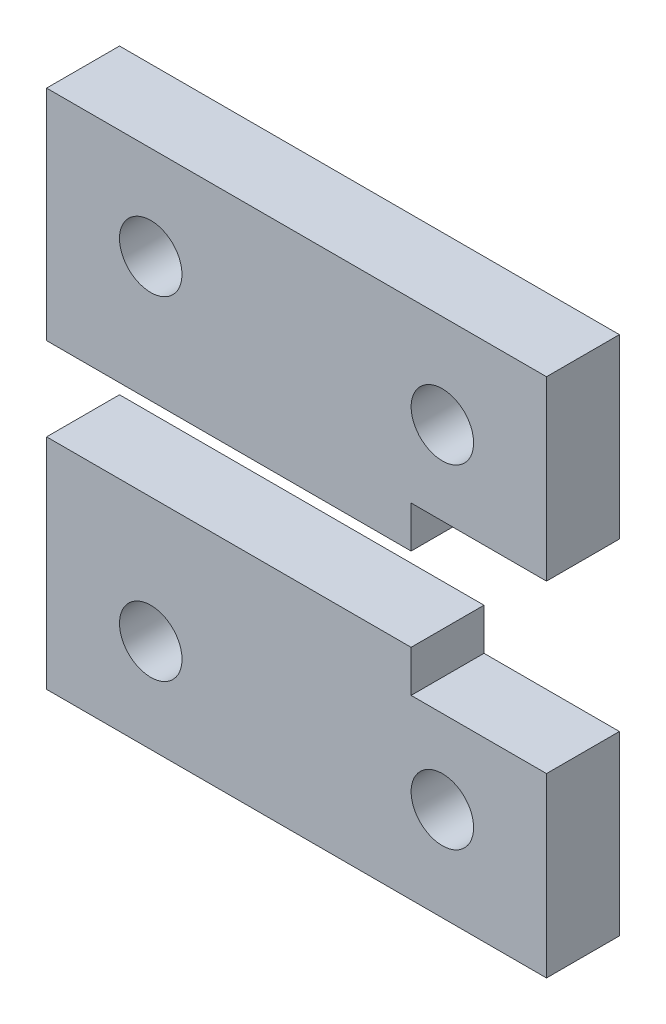
ISO-10303-21;
HEADER;
FILE_DESCRIPTION(('STEP AP214'),'2;1');
FILE_NAME('part.step','',(''),(''),'','','');
FILE_SCHEMA(('AUTOMOTIVE_DESIGN { 1 0 10303 214 1 1 1 1 }'));
ENDSEC;
DATA;
#1=APPLICATION_CONTEXT('core data for automotive mechanical design processes');
#2=APPLICATION_PROTOCOL_DEFINITION('international standard','automotive_design',2000,#1);
#3=PRODUCT_CONTEXT('',#1,'mechanical');
#4=PRODUCT('Part','Part','',(#3));
#5=PRODUCT_RELATED_PRODUCT_CATEGORY('part','',(#4));
#6=PRODUCT_DEFINITION_FORMATION('','',#4);
#7=PRODUCT_DEFINITION_CONTEXT('part definition',#1,'design');
#8=PRODUCT_DEFINITION('design','',#6,#7);
#9=PRODUCT_DEFINITION_SHAPE('','',#8);
#10=(LENGTH_UNIT() NAMED_UNIT(*) SI_UNIT(.MILLI.,.METRE.));
#11=(NAMED_UNIT(*) PLANE_ANGLE_UNIT() SI_UNIT($,.RADIAN.));
#12=(NAMED_UNIT(*) SI_UNIT($,.STERADIAN.) SOLID_ANGLE_UNIT());
#13=UNCERTAINTY_MEASURE_WITH_UNIT(LENGTH_MEASURE(1.E-05),#10,'distance_accuracy_value','');
#14=(GEOMETRIC_REPRESENTATION_CONTEXT(3) GLOBAL_UNCERTAINTY_ASSIGNED_CONTEXT((#13)) GLOBAL_UNIT_ASSIGNED_CONTEXT((#10,
#11,#12)) REPRESENTATION_CONTEXT('',''));
#15=CARTESIAN_POINT('',(0.,0.,0.));
#16=DIRECTION('',(0.,0.,1.));
#17=DIRECTION('',(1.,0.,0.));
#18=AXIS2_PLACEMENT_3D('',#15,#16,#17);
#19=CARTESIAN_POINT('',(0.,0.,3.5));
#20=DIRECTION('',(0.,0.,-1.));
#21=DIRECTION('',(-1.,0.,0.));
#22=AXIS2_PLACEMENT_3D('',#19,#20,#21);
#23=PLANE('',#22);
#24=CARTESIAN_POINT('',(19.,20.5,3.5));
#25=DIRECTION('',(0.,0.,1.));
#26=DIRECTION('',(-1.,0.,0.));
#27=AXIS2_PLACEMENT_3D('',#24,#25,#26);
#28=CIRCLE('',#27,1.5);
#29=CARTESIAN_POINT('',(17.5,20.5,3.5));
#30=VERTEX_POINT('',#29);
#31=EDGE_CURVE('E132',#30,#30,#28,.T.);
#32=ORIENTED_EDGE('',*,*,#31,.F.);
#33=EDGE_LOOP('',(#32));
#34=FACE_BOUND('',#33,.T.);
#35=DIRECTION('',(1.,0.,0.));
#36=VECTOR('',#35,1.);
#37=CARTESIAN_POINT('',(17.5,14.5,3.5));
#38=LINE('',#37,#36);
#39=CARTESIAN_POINT('',(0.,14.5,3.5));
#40=VERTEX_POINT('',#39);
#41=CARTESIAN_POINT('',(17.5,14.5,3.5));
#42=VERTEX_POINT('',#41);
#43=EDGE_CURVE('E139',#40,#42,#38,.T.);
#44=ORIENTED_EDGE('',*,*,#43,.T.);
#45=DIRECTION('',(0.,1.,0.));
#46=VECTOR('',#45,1.);
#47=CARTESIAN_POINT('',(17.5,16.5,3.5));
#48=LINE('',#47,#46);
#49=CARTESIAN_POINT('',(17.5,16.5,3.5));
#50=VERTEX_POINT('',#49);
#51=EDGE_CURVE('E97',#42,#50,#48,.T.);
#52=ORIENTED_EDGE('',*,*,#51,.T.);
#53=DIRECTION('',(1.,0.,0.));
#54=VECTOR('',#53,1.);
#55=CARTESIAN_POINT('',(17.5,16.5,3.5));
#56=LINE('',#55,#54);
#57=CARTESIAN_POINT('',(24.,16.5,3.5));
#58=VERTEX_POINT('',#57);
#59=EDGE_CURVE('E110',#50,#58,#56,.T.);
#60=ORIENTED_EDGE('',*,*,#59,.T.);
#61=DIRECTION('',(0.,1.,0.));
#62=VECTOR('',#61,1.);
#63=CARTESIAN_POINT('',(24.,25.,3.5));
#64=LINE('',#63,#62);
#65=CARTESIAN_POINT('',(24.,25.,3.5));
#66=VERTEX_POINT('',#65);
#67=EDGE_CURVE('E104',#58,#66,#64,.T.);
#68=ORIENTED_EDGE('',*,*,#67,.T.);
#69=DIRECTION('',(-1.,0.,0.));
#70=VECTOR('',#69,1.);
#71=CARTESIAN_POINT('',(0.,25.,3.5));
#72=LINE('',#71,#70);
#73=CARTESIAN_POINT('',(0.,25.,3.5));
#74=VERTEX_POINT('',#73);
#75=EDGE_CURVE('E108',#66,#74,#72,.T.);
#76=ORIENTED_EDGE('',*,*,#75,.T.);
#77=DIRECTION('',(0.,-1.,0.));
#78=VECTOR('',#77,1.);
#79=CARTESIAN_POINT('',(0.,14.5,3.5));
#80=LINE('',#79,#78);
#81=EDGE_CURVE('E60',#74,#40,#80,.T.);
#82=ORIENTED_EDGE('',*,*,#81,.T.);
#83=EDGE_LOOP('',(#44,#52,#60,#68,#76,#82));
#84=FACE_BOUND('',#83,.T.);
#85=CARTESIAN_POINT('',(5.,20.5,3.5));
#86=DIRECTION('',(0.,0.,1.));
#87=DIRECTION('',(-1.,0.,0.));
#88=AXIS2_PLACEMENT_3D('',#85,#86,#87);
#89=CIRCLE('',#88,1.5);
#90=CARTESIAN_POINT('',(3.5,20.5,3.5));
#91=VERTEX_POINT('',#90);
#92=EDGE_CURVE('E182',#91,#91,#89,.T.);
#93=ORIENTED_EDGE('',*,*,#92,.F.);
#94=EDGE_LOOP('',(#93));
#95=FACE_BOUND('',#94,.T.);
#96=ADVANCED_FACE('F43',(#34,#84,#95),#23,.F.);
#97=CARTESIAN_POINT('',(0.,0.,0.));
#98=DIRECTION('',(0.,0.,-1.));
#99=DIRECTION('',(-1.,0.,0.));
#100=AXIS2_PLACEMENT_3D('',#97,#98,#99);
#101=PLANE('',#100);
#102=CARTESIAN_POINT('',(19.,20.5,0.));
#103=DIRECTION('',(0.,0.,1.));
#104=DIRECTION('',(-1.,0.,0.));
#105=AXIS2_PLACEMENT_3D('',#102,#103,#104);
#106=CIRCLE('',#105,1.5);
#107=CARTESIAN_POINT('',(17.5,20.5,0.));
#108=VERTEX_POINT('',#107);
#109=EDGE_CURVE('E187',#108,#108,#106,.T.);
#110=ORIENTED_EDGE('',*,*,#109,.T.);
#111=EDGE_LOOP('',(#110));
#112=FACE_BOUND('',#111,.T.);
#113=DIRECTION('',(1.,0.,0.));
#114=VECTOR('',#113,1.);
#115=CARTESIAN_POINT('',(17.5,14.5,0.));
#116=LINE('',#115,#114);
#117=CARTESIAN_POINT('',(0.,14.5,0.));
#118=VERTEX_POINT('',#117);
#119=CARTESIAN_POINT('',(17.5,14.5,0.));
#120=VERTEX_POINT('',#119);
#121=EDGE_CURVE('E128',#118,#120,#116,.T.);
#122=ORIENTED_EDGE('',*,*,#121,.F.);
#123=DIRECTION('',(0.,-1.,0.));
#124=VECTOR('',#123,1.);
#125=CARTESIAN_POINT('',(0.,14.5,0.));
#126=LINE('',#125,#124);
#127=CARTESIAN_POINT('',(0.,25.,0.));
#128=VERTEX_POINT('',#127);
#129=EDGE_CURVE('E89',#128,#118,#126,.T.);
#130=ORIENTED_EDGE('',*,*,#129,.F.);
#131=DIRECTION('',(-1.,0.,0.));
#132=VECTOR('',#131,1.);
#133=CARTESIAN_POINT('',(0.,25.,0.));
#134=LINE('',#133,#132);
#135=CARTESIAN_POINT('',(24.,25.,0.));
#136=VERTEX_POINT('',#135);
#137=EDGE_CURVE('E83',#136,#128,#134,.T.);
#138=ORIENTED_EDGE('',*,*,#137,.F.);
#139=DIRECTION('',(0.,1.,0.));
#140=VECTOR('',#139,1.);
#141=CARTESIAN_POINT('',(24.,25.,0.));
#142=LINE('',#141,#140);
#143=CARTESIAN_POINT('',(24.,16.5,0.));
#144=VERTEX_POINT('',#143);
#145=EDGE_CURVE('E118',#144,#136,#142,.T.);
#146=ORIENTED_EDGE('',*,*,#145,.F.);
#147=DIRECTION('',(1.,0.,0.));
#148=VECTOR('',#147,1.);
#149=CARTESIAN_POINT('',(17.5,16.5,0.));
#150=LINE('',#149,#148);
#151=CARTESIAN_POINT('',(17.5,16.5,0.));
#152=VERTEX_POINT('',#151);
#153=EDGE_CURVE('E134',#152,#144,#150,.T.);
#154=ORIENTED_EDGE('',*,*,#153,.F.);
#155=DIRECTION('',(0.,1.,0.));
#156=VECTOR('',#155,1.);
#157=CARTESIAN_POINT('',(17.5,16.5,0.));
#158=LINE('',#157,#156);
#159=EDGE_CURVE('E131',#120,#152,#158,.T.);
#160=ORIENTED_EDGE('',*,*,#159,.F.);
#161=EDGE_LOOP('',(#122,#130,#138,#146,#154,#160));
#162=FACE_BOUND('',#161,.T.);
#163=CARTESIAN_POINT('',(5.,20.5,0.));
#164=DIRECTION('',(0.,0.,1.));
#165=DIRECTION('',(-1.,0.,0.));
#166=AXIS2_PLACEMENT_3D('',#163,#164,#165);
#167=CIRCLE('',#166,1.5);
#168=CARTESIAN_POINT('',(3.5,20.5,0.));
#169=VERTEX_POINT('',#168);
#170=EDGE_CURVE('E185',#169,#169,#167,.T.);
#171=ORIENTED_EDGE('',*,*,#170,.T.);
#172=EDGE_LOOP('',(#171));
#173=FACE_BOUND('',#172,.T.);
#174=ADVANCED_FACE('F148',(#112,#162,#173),#101,.T.);
#175=CARTESIAN_POINT('',(17.5,14.5,3.5));
#176=DIRECTION('',(0.,1.,0.));
#177=DIRECTION('',(-1.,0.,0.));
#178=AXIS2_PLACEMENT_3D('',#175,#176,#177);
#179=PLANE('',#178);
#180=ORIENTED_EDGE('',*,*,#121,.T.);
#181=DIRECTION('',(0.,0.,-1.));
#182=VECTOR('',#181,1.);
#183=CARTESIAN_POINT('',(17.5,14.5,3.5));
#184=LINE('',#183,#182);
#185=EDGE_CURVE('E12',#42,#120,#184,.T.);
#186=ORIENTED_EDGE('',*,*,#185,.F.);
#187=ORIENTED_EDGE('',*,*,#43,.F.);
#188=DIRECTION('',(0.,0.,-1.));
#189=VECTOR('',#188,1.);
#190=CARTESIAN_POINT('',(0.,14.5,3.5));
#191=LINE('',#190,#189);
#192=EDGE_CURVE('E124',#40,#118,#191,.T.);
#193=ORIENTED_EDGE('',*,*,#192,.T.);
#194=EDGE_LOOP('',(#180,#186,#187,#193));
#195=FACE_BOUND('',#194,.T.);
#196=ADVANCED_FACE('F45',(#195),#179,.F.);
#197=CARTESIAN_POINT('',(17.5,16.5,3.5));
#198=DIRECTION('',(-1.,0.,0.));
#199=DIRECTION('',(0.,0.,1.));
#200=AXIS2_PLACEMENT_3D('',#197,#198,#199);
#201=PLANE('',#200);
#202=ORIENTED_EDGE('',*,*,#159,.T.);
#203=DIRECTION('',(0.,0.,-1.));
#204=VECTOR('',#203,1.);
#205=CARTESIAN_POINT('',(17.5,16.5,3.5));
#206=LINE('',#205,#204);
#207=EDGE_CURVE('E52',#50,#152,#206,.T.);
#208=ORIENTED_EDGE('',*,*,#207,.F.);
#209=ORIENTED_EDGE('',*,*,#51,.F.);
#210=ORIENTED_EDGE('',*,*,#185,.T.);
#211=EDGE_LOOP('',(#202,#208,#209,#210));
#212=FACE_BOUND('',#211,.T.);
#213=ADVANCED_FACE('F228',(#212),#201,.F.);
#214=CARTESIAN_POINT('',(17.5,16.5,3.5));
#215=DIRECTION('',(0.,1.,0.));
#216=DIRECTION('',(0.,0.,1.));
#217=AXIS2_PLACEMENT_3D('',#214,#215,#216);
#218=PLANE('',#217);
#219=ORIENTED_EDGE('',*,*,#153,.T.);
#220=DIRECTION('',(0.,0.,-1.));
#221=VECTOR('',#220,1.);
#222=CARTESIAN_POINT('',(24.,16.5,3.5));
#223=LINE('',#222,#221);
#224=EDGE_CURVE('E119',#58,#144,#223,.T.);
#225=ORIENTED_EDGE('',*,*,#224,.F.);
#226=ORIENTED_EDGE('',*,*,#59,.F.);
#227=ORIENTED_EDGE('',*,*,#207,.T.);
#228=EDGE_LOOP('',(#219,#225,#226,#227));
#229=FACE_BOUND('',#228,.T.);
#230=ADVANCED_FACE('F145',(#229),#218,.F.);
#231=CARTESIAN_POINT('',(24.,25.,3.5));
#232=DIRECTION('',(-1.,0.,0.));
#233=DIRECTION('',(0.,0.,1.));
#234=AXIS2_PLACEMENT_3D('',#231,#232,#233);
#235=PLANE('',#234);
#236=ORIENTED_EDGE('',*,*,#145,.T.);
#237=DIRECTION('',(0.,0.,-1.));
#238=VECTOR('',#237,1.);
#239=CARTESIAN_POINT('',(24.,25.,3.5));
#240=LINE('',#239,#238);
#241=EDGE_CURVE('E115',#66,#136,#240,.T.);
#242=ORIENTED_EDGE('',*,*,#241,.F.);
#243=ORIENTED_EDGE('',*,*,#67,.F.);
#244=ORIENTED_EDGE('',*,*,#224,.T.);
#245=EDGE_LOOP('',(#236,#242,#243,#244));
#246=FACE_BOUND('',#245,.T.);
#247=ADVANCED_FACE('F116',(#246),#235,.F.);
#248=CARTESIAN_POINT('',(0.,25.,3.5));
#249=DIRECTION('',(0.,-1.,0.));
#250=DIRECTION('',(0.,0.,-1.));
#251=AXIS2_PLACEMENT_3D('',#248,#249,#250);
#252=PLANE('',#251);
#253=ORIENTED_EDGE('',*,*,#137,.T.);
#254=DIRECTION('',(0.,0.,-1.));
#255=VECTOR('',#254,1.);
#256=CARTESIAN_POINT('',(0.,25.,3.5));
#257=LINE('',#256,#255);
#258=EDGE_CURVE('E120',#74,#128,#257,.T.);
#259=ORIENTED_EDGE('',*,*,#258,.F.);
#260=ORIENTED_EDGE('',*,*,#75,.F.);
#261=ORIENTED_EDGE('',*,*,#241,.T.);
#262=EDGE_LOOP('',(#253,#259,#260,#261));
#263=FACE_BOUND('',#262,.T.);
#264=ADVANCED_FACE('F122',(#263),#252,.F.);
#265=CARTESIAN_POINT('',(0.,14.5,3.5));
#266=DIRECTION('',(1.,0.,0.));
#267=DIRECTION('',(0.,1.,0.));
#268=AXIS2_PLACEMENT_3D('',#265,#266,#267);
#269=PLANE('',#268);
#270=ORIENTED_EDGE('',*,*,#129,.T.);
#271=ORIENTED_EDGE('',*,*,#192,.F.);
#272=ORIENTED_EDGE('',*,*,#81,.F.);
#273=ORIENTED_EDGE('',*,*,#258,.T.);
#274=EDGE_LOOP('',(#270,#271,#272,#273));
#275=FACE_BOUND('',#274,.T.);
#276=ADVANCED_FACE('F153',(#275),#269,.F.);
#277=CARTESIAN_POINT('',(19.,20.5,3.5));
#278=DIRECTION('',(0.,0.,-1.));
#279=DIRECTION('',(-1.,0.,0.));
#280=AXIS2_PLACEMENT_3D('',#277,#278,#279);
#281=CYLINDRICAL_SURFACE('',#280,1.5);
#282=ORIENTED_EDGE('',*,*,#31,.T.);
#283=EDGE_LOOP('',(#282));
#284=FACE_BOUND('',#283,.T.);
#285=ORIENTED_EDGE('',*,*,#109,.F.);
#286=EDGE_LOOP('',(#285));
#287=FACE_BOUND('',#286,.T.);
#288=ADVANCED_FACE('F155',(#284,#287),#281,.F.);
#289=CARTESIAN_POINT('',(5.,20.5,3.5));
#290=DIRECTION('',(0.,0.,-1.));
#291=DIRECTION('',(-1.,0.,0.));
#292=AXIS2_PLACEMENT_3D('',#289,#290,#291);
#293=CYLINDRICAL_SURFACE('',#292,1.5);
#294=ORIENTED_EDGE('',*,*,#92,.T.);
#295=EDGE_LOOP('',(#294));
#296=FACE_BOUND('',#295,.T.);
#297=ORIENTED_EDGE('',*,*,#170,.F.);
#298=EDGE_LOOP('',(#297));
#299=FACE_BOUND('',#298,.T.);
#300=ADVANCED_FACE('F161',(#296,#299),#293,.F.);
#301=CLOSED_SHELL('',(#96,#174,#196,#213,#230,#247,#264,#276,#288,#300));
#302=MANIFOLD_SOLID_BREP('B2',#301);
#303=CARTESIAN_POINT('',(0.,0.,3.5));
#304=DIRECTION('',(0.,0.,1.));
#305=DIRECTION('',(1.,0.,0.));
#306=AXIS2_PLACEMENT_3D('',#303,#304,#305);
#307=PLANE('',#306);
#308=CARTESIAN_POINT('',(5.,4.5,3.5));
#309=DIRECTION('',(0.,0.,1.));
#310=DIRECTION('',(1.,0.,0.));
#311=AXIS2_PLACEMENT_3D('',#308,#309,#310);
#312=CIRCLE('',#311,1.5);
#313=CARTESIAN_POINT('',(6.5,4.5,3.5));
#314=VERTEX_POINT('',#313);
#315=EDGE_CURVE('E350',#314,#314,#312,.T.);
#316=ORIENTED_EDGE('',*,*,#315,.F.);
#317=EDGE_LOOP('',(#316));
#318=FACE_BOUND('',#317,.T.);
#319=DIRECTION('',(0.,-1.,0.));
#320=VECTOR('',#319,1.);
#321=CARTESIAN_POINT('',(0.,10.5,3.5));
#322=LINE('',#321,#320);
#323=CARTESIAN_POINT('',(0.,10.5,3.5));
#324=VERTEX_POINT('',#323);
#325=CARTESIAN_POINT('',(0.,0.,3.5));
#326=VERTEX_POINT('',#325);
#327=EDGE_CURVE('E357',#324,#326,#322,.T.);
#328=ORIENTED_EDGE('',*,*,#327,.T.);
#329=DIRECTION('',(1.,0.,0.));
#330=VECTOR('',#329,1.);
#331=CARTESIAN_POINT('',(0.,0.,3.5));
#332=LINE('',#331,#330);
#333=CARTESIAN_POINT('',(24.,0.,3.5));
#334=VERTEX_POINT('',#333);
#335=EDGE_CURVE('E315',#326,#334,#332,.T.);
#336=ORIENTED_EDGE('',*,*,#335,.T.);
#337=DIRECTION('',(0.,1.,0.));
#338=VECTOR('',#337,1.);
#339=CARTESIAN_POINT('',(24.,0.,3.5));
#340=LINE('',#339,#338);
#341=CARTESIAN_POINT('',(24.,8.5,3.5));
#342=VERTEX_POINT('',#341);
#343=EDGE_CURVE('E328',#334,#342,#340,.T.);
#344=ORIENTED_EDGE('',*,*,#343,.T.);
#345=DIRECTION('',(-1.,0.,0.));
#346=VECTOR('',#345,1.);
#347=CARTESIAN_POINT('',(17.5,8.5,3.5));
#348=LINE('',#347,#346);
#349=CARTESIAN_POINT('',(17.5,8.5,3.5));
#350=VERTEX_POINT('',#349);
#351=EDGE_CURVE('E322',#342,#350,#348,.T.);
#352=ORIENTED_EDGE('',*,*,#351,.T.);
#353=DIRECTION('',(0.,1.,0.));
#354=VECTOR('',#353,1.);
#355=CARTESIAN_POINT('',(17.5,8.5,3.5));
#356=LINE('',#355,#354);
#357=CARTESIAN_POINT('',(17.5,10.5,3.5));
#358=VERTEX_POINT('',#357);
#359=EDGE_CURVE('E326',#350,#358,#356,.T.);
#360=ORIENTED_EDGE('',*,*,#359,.T.);
#361=DIRECTION('',(-1.,0.,0.));
#362=VECTOR('',#361,1.);
#363=CARTESIAN_POINT('',(17.5,10.5,3.5));
#364=LINE('',#363,#362);
#365=EDGE_CURVE('E278',#358,#324,#364,.T.);
#366=ORIENTED_EDGE('',*,*,#365,.T.);
#367=EDGE_LOOP('',(#328,#336,#344,#352,#360,#366));
#368=FACE_BOUND('',#367,.T.);
#369=CARTESIAN_POINT('',(19.,4.5,3.5));
#370=DIRECTION('',(0.,0.,1.));
#371=DIRECTION('',(1.,0.,0.));
#372=AXIS2_PLACEMENT_3D('',#369,#370,#371);
#373=CIRCLE('',#372,1.5);
#374=CARTESIAN_POINT('',(20.5,4.5,3.5));
#375=VERTEX_POINT('',#374);
#376=EDGE_CURVE('E400',#375,#375,#373,.T.);
#377=ORIENTED_EDGE('',*,*,#376,.F.);
#378=EDGE_LOOP('',(#377));
#379=FACE_BOUND('',#378,.T.);
#380=ADVANCED_FACE('F261',(#318,#368,#379),#307,.T.);
#381=CARTESIAN_POINT('',(0.,0.,0.));
#382=DIRECTION('',(0.,0.,1.));
#383=DIRECTION('',(1.,0.,0.));
#384=AXIS2_PLACEMENT_3D('',#381,#382,#383);
#385=PLANE('',#384);
#386=CARTESIAN_POINT('',(5.,4.5,0.));
#387=DIRECTION('',(0.,0.,1.));
#388=DIRECTION('',(1.,0.,0.));
#389=AXIS2_PLACEMENT_3D('',#386,#387,#388);
#390=CIRCLE('',#389,1.5);
#391=CARTESIAN_POINT('',(6.5,4.5,0.));
#392=VERTEX_POINT('',#391);
#393=EDGE_CURVE('E405',#392,#392,#390,.T.);
#394=ORIENTED_EDGE('',*,*,#393,.T.);
#395=EDGE_LOOP('',(#394));
#396=FACE_BOUND('',#395,.T.);
#397=DIRECTION('',(0.,-1.,0.));
#398=VECTOR('',#397,1.);
#399=CARTESIAN_POINT('',(0.,10.5,0.));
#400=LINE('',#399,#398);
#401=CARTESIAN_POINT('',(0.,10.5,0.));
#402=VERTEX_POINT('',#401);
#403=CARTESIAN_POINT('',(0.,0.,0.));
#404=VERTEX_POINT('',#403);
#405=EDGE_CURVE('E346',#402,#404,#400,.T.);
#406=ORIENTED_EDGE('',*,*,#405,.F.);
#407=DIRECTION('',(-1.,0.,0.));
#408=VECTOR('',#407,1.);
#409=CARTESIAN_POINT('',(17.5,10.5,0.));
#410=LINE('',#409,#408);
#411=CARTESIAN_POINT('',(17.5,10.5,0.));
#412=VERTEX_POINT('',#411);
#413=EDGE_CURVE('E307',#412,#402,#410,.T.);
#414=ORIENTED_EDGE('',*,*,#413,.F.);
#415=DIRECTION('',(0.,1.,0.));
#416=VECTOR('',#415,1.);
#417=CARTESIAN_POINT('',(17.5,8.5,0.));
#418=LINE('',#417,#416);
#419=CARTESIAN_POINT('',(17.5,8.5,0.));
#420=VERTEX_POINT('',#419);
#421=EDGE_CURVE('E301',#420,#412,#418,.T.);
#422=ORIENTED_EDGE('',*,*,#421,.F.);
#423=DIRECTION('',(-1.,0.,0.));
#424=VECTOR('',#423,1.);
#425=CARTESIAN_POINT('',(17.5,8.5,0.));
#426=LINE('',#425,#424);
#427=CARTESIAN_POINT('',(24.,8.5,0.));
#428=VERTEX_POINT('',#427);
#429=EDGE_CURVE('E336',#428,#420,#426,.T.);
#430=ORIENTED_EDGE('',*,*,#429,.F.);
#431=DIRECTION('',(0.,1.,0.));
#432=VECTOR('',#431,1.);
#433=CARTESIAN_POINT('',(24.,0.,0.));
#434=LINE('',#433,#432);
#435=CARTESIAN_POINT('',(24.,0.,0.));
#436=VERTEX_POINT('',#435);
#437=EDGE_CURVE('E352',#436,#428,#434,.T.);
#438=ORIENTED_EDGE('',*,*,#437,.F.);
#439=DIRECTION('',(1.,0.,0.));
#440=VECTOR('',#439,1.);
#441=CARTESIAN_POINT('',(0.,0.,0.));
#442=LINE('',#441,#440);
#443=EDGE_CURVE('E349',#404,#436,#442,.T.);
#444=ORIENTED_EDGE('',*,*,#443,.F.);
#445=EDGE_LOOP('',(#406,#414,#422,#430,#438,#444));
#446=FACE_BOUND('',#445,.T.);
#447=CARTESIAN_POINT('',(19.,4.5,0.));
#448=DIRECTION('',(0.,0.,1.));
#449=DIRECTION('',(1.,0.,0.));
#450=AXIS2_PLACEMENT_3D('',#447,#448,#449);
#451=CIRCLE('',#450,1.5);
#452=CARTESIAN_POINT('',(20.5,4.5,0.));
#453=VERTEX_POINT('',#452);
#454=EDGE_CURVE('E403',#453,#453,#451,.T.);
#455=ORIENTED_EDGE('',*,*,#454,.T.);
#456=EDGE_LOOP('',(#455));
#457=FACE_BOUND('',#456,.T.);
#458=ADVANCED_FACE('F366',(#396,#446,#457),#385,.F.);
#459=CARTESIAN_POINT('',(0.,10.5,3.5));
#460=DIRECTION('',(1.,0.,0.));
#461=DIRECTION('',(0.,1.,0.));
#462=AXIS2_PLACEMENT_3D('',#459,#460,#461);
#463=PLANE('',#462);
#464=ORIENTED_EDGE('',*,*,#405,.T.);
#465=DIRECTION('',(0.,0.,-1.));
#466=VECTOR('',#465,1.);
#467=CARTESIAN_POINT('',(0.,0.,3.5));
#468=LINE('',#467,#466);
#469=EDGE_CURVE('E41',#326,#404,#468,.T.);
#470=ORIENTED_EDGE('',*,*,#469,.F.);
#471=ORIENTED_EDGE('',*,*,#327,.F.);
#472=DIRECTION('',(0.,0.,-1.));
#473=VECTOR('',#472,1.);
#474=CARTESIAN_POINT('',(0.,10.5,3.5));
#475=LINE('',#474,#473);
#476=EDGE_CURVE('E342',#324,#402,#475,.T.);
#477=ORIENTED_EDGE('',*,*,#476,.T.);
#478=EDGE_LOOP('',(#464,#470,#471,#477));
#479=FACE_BOUND('',#478,.T.);
#480=ADVANCED_FACE('F263',(#479),#463,.F.);
#481=CARTESIAN_POINT('',(0.,0.,3.5));
#482=DIRECTION('',(0.,1.,0.));
#483=DIRECTION('',(0.,0.,1.));
#484=AXIS2_PLACEMENT_3D('',#481,#482,#483);
#485=PLANE('',#484);
#486=ORIENTED_EDGE('',*,*,#443,.T.);
#487=DIRECTION('',(0.,0.,-1.));
#488=VECTOR('',#487,1.);
#489=CARTESIAN_POINT('',(24.,0.,3.5));
#490=LINE('',#489,#488);
#491=EDGE_CURVE('E270',#334,#436,#490,.T.);
#492=ORIENTED_EDGE('',*,*,#491,.F.);
#493=ORIENTED_EDGE('',*,*,#335,.F.);
#494=ORIENTED_EDGE('',*,*,#469,.T.);
#495=EDGE_LOOP('',(#486,#492,#493,#494));
#496=FACE_BOUND('',#495,.T.);
#497=ADVANCED_FACE('F446',(#496),#485,.F.);
#498=CARTESIAN_POINT('',(24.,0.,3.5));
#499=DIRECTION('',(-1.,0.,0.));
#500=DIRECTION('',(0.,0.,1.));
#501=AXIS2_PLACEMENT_3D('',#498,#499,#500);
#502=PLANE('',#501);
#503=ORIENTED_EDGE('',*,*,#437,.T.);
#504=DIRECTION('',(0.,0.,-1.));
#505=VECTOR('',#504,1.);
#506=CARTESIAN_POINT('',(24.,8.5,3.5));
#507=LINE('',#506,#505);
#508=EDGE_CURVE('E337',#342,#428,#507,.T.);
#509=ORIENTED_EDGE('',*,*,#508,.F.);
#510=ORIENTED_EDGE('',*,*,#343,.F.);
#511=ORIENTED_EDGE('',*,*,#491,.T.);
#512=EDGE_LOOP('',(#503,#509,#510,#511));
#513=FACE_BOUND('',#512,.T.);
#514=ADVANCED_FACE('F363',(#513),#502,.F.);
#515=CARTESIAN_POINT('',(17.5,8.5,3.5));
#516=DIRECTION('',(0.,-1.,0.));
#517=DIRECTION('',(0.,0.,-1.));
#518=AXIS2_PLACEMENT_3D('',#515,#516,#517);
#519=PLANE('',#518);
#520=ORIENTED_EDGE('',*,*,#429,.T.);
#521=DIRECTION('',(0.,0.,-1.));
#522=VECTOR('',#521,1.);
#523=CARTESIAN_POINT('',(17.5,8.5,3.5));
#524=LINE('',#523,#522);
#525=EDGE_CURVE('E333',#350,#420,#524,.T.);
#526=ORIENTED_EDGE('',*,*,#525,.F.);
#527=ORIENTED_EDGE('',*,*,#351,.F.);
#528=ORIENTED_EDGE('',*,*,#508,.T.);
#529=EDGE_LOOP('',(#520,#526,#527,#528));
#530=FACE_BOUND('',#529,.T.);
#531=ADVANCED_FACE('F334',(#530),#519,.F.);
#532=CARTESIAN_POINT('',(17.5,8.5,3.5));
#533=DIRECTION('',(-1.,0.,0.));
#534=DIRECTION('',(0.,0.,1.));
#535=AXIS2_PLACEMENT_3D('',#532,#533,#534);
#536=PLANE('',#535);
#537=ORIENTED_EDGE('',*,*,#421,.T.);
#538=DIRECTION('',(0.,0.,-1.));
#539=VECTOR('',#538,1.);
#540=CARTESIAN_POINT('',(17.5,10.5,3.5));
#541=LINE('',#540,#539);
#542=EDGE_CURVE('E338',#358,#412,#541,.T.);
#543=ORIENTED_EDGE('',*,*,#542,.F.);
#544=ORIENTED_EDGE('',*,*,#359,.F.);
#545=ORIENTED_EDGE('',*,*,#525,.T.);
#546=EDGE_LOOP('',(#537,#543,#544,#545));
#547=FACE_BOUND('',#546,.T.);
#548=ADVANCED_FACE('F340',(#547),#536,.F.);
#549=CARTESIAN_POINT('',(17.5,10.5,3.5));
#550=DIRECTION('',(0.,-1.,0.));
#551=DIRECTION('',(1.,0.,0.));
#552=AXIS2_PLACEMENT_3D('',#549,#550,#551);
#553=PLANE('',#552);
#554=ORIENTED_EDGE('',*,*,#413,.T.);
#555=ORIENTED_EDGE('',*,*,#476,.F.);
#556=ORIENTED_EDGE('',*,*,#365,.F.);
#557=ORIENTED_EDGE('',*,*,#542,.T.);
#558=EDGE_LOOP('',(#554,#555,#556,#557));
#559=FACE_BOUND('',#558,.T.);
#560=ADVANCED_FACE('F371',(#559),#553,.F.);
#561=CARTESIAN_POINT('',(5.,4.5,3.5));
#562=DIRECTION('',(0.,0.,-1.));
#563=DIRECTION('',(-1.,0.,0.));
#564=AXIS2_PLACEMENT_3D('',#561,#562,#563);
#565=CYLINDRICAL_SURFACE('',#564,1.5);
#566=ORIENTED_EDGE('',*,*,#315,.T.);
#567=EDGE_LOOP('',(#566));
#568=FACE_BOUND('',#567,.T.);
#569=ORIENTED_EDGE('',*,*,#393,.F.);
#570=EDGE_LOOP('',(#569));
#571=FACE_BOUND('',#570,.T.);
#572=ADVANCED_FACE('F373',(#568,#571),#565,.F.);
#573=CARTESIAN_POINT('',(19.,4.5,3.5));
#574=DIRECTION('',(0.,0.,-1.));
#575=DIRECTION('',(-1.,0.,0.));
#576=AXIS2_PLACEMENT_3D('',#573,#574,#575);
#577=CYLINDRICAL_SURFACE('',#576,1.5);
#578=ORIENTED_EDGE('',*,*,#376,.T.);
#579=EDGE_LOOP('',(#578));
#580=FACE_BOUND('',#579,.T.);
#581=ORIENTED_EDGE('',*,*,#454,.F.);
#582=EDGE_LOOP('',(#581));
#583=FACE_BOUND('',#582,.T.);
#584=ADVANCED_FACE('F379',(#580,#583),#577,.F.);
#585=CLOSED_SHELL('',(#380,#458,#480,#497,#514,#531,#548,#560,#572,#584));
#586=MANIFOLD_SOLID_BREP('B6',#585);
#587=ADVANCED_BREP_SHAPE_REPRESENTATION('',(#18,#302,#586),#14);
#588=SHAPE_DEFINITION_REPRESENTATION(#9,#587);
ENDSEC;
END-ISO-10303-21;
